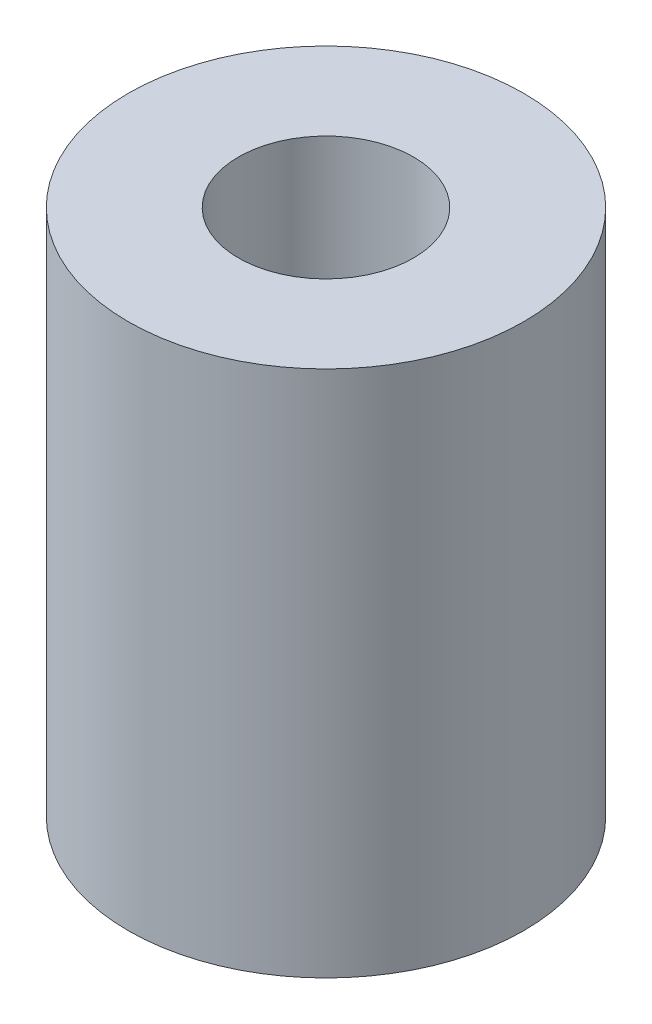
ISO-10303-21;
HEADER;
FILE_DESCRIPTION(('STEP AP214'),'2;1');
FILE_NAME('part.step','',(''),(''),'','','');
FILE_SCHEMA(('AUTOMOTIVE_DESIGN { 1 0 10303 214 1 1 1 1 }'));
ENDSEC;
DATA;
#1=APPLICATION_CONTEXT('core data for automotive mechanical design processes');
#2=APPLICATION_PROTOCOL_DEFINITION('international standard','automotive_design',2000,#1);
#3=PRODUCT_CONTEXT('',#1,'mechanical');
#4=PRODUCT('Part','Part','',(#3));
#5=PRODUCT_RELATED_PRODUCT_CATEGORY('part','',(#4));
#6=PRODUCT_DEFINITION_FORMATION('','',#4);
#7=PRODUCT_DEFINITION_CONTEXT('part definition',#1,'design');
#8=PRODUCT_DEFINITION('design','',#6,#7);
#9=PRODUCT_DEFINITION_SHAPE('','',#8);
#10=(LENGTH_UNIT() NAMED_UNIT(*) SI_UNIT(.MILLI.,.METRE.));
#11=(NAMED_UNIT(*) PLANE_ANGLE_UNIT() SI_UNIT($,.RADIAN.));
#12=(NAMED_UNIT(*) SI_UNIT($,.STERADIAN.) SOLID_ANGLE_UNIT());
#13=UNCERTAINTY_MEASURE_WITH_UNIT(LENGTH_MEASURE(1.E-05),#10,'distance_accuracy_value','');
#14=(GEOMETRIC_REPRESENTATION_CONTEXT(3) GLOBAL_UNCERTAINTY_ASSIGNED_CONTEXT((#13)) GLOBAL_UNIT_ASSIGNED_CONTEXT((#10,
#11,#12)) REPRESENTATION_CONTEXT('',''));
#15=CARTESIAN_POINT('',(0.,0.,0.));
#16=DIRECTION('',(0.,0.,1.));
#17=DIRECTION('',(1.,0.,0.));
#18=AXIS2_PLACEMENT_3D('',#15,#16,#17);
#19=CARTESIAN_POINT('',(0.,6.35,0.));
#20=DIRECTION('',(0.,-1.,0.));
#21=DIRECTION('',(0.,0.,-1.));
#22=AXIS2_PLACEMENT_3D('',#19,#20,#21);
#23=CYLINDRICAL_SURFACE('',#22,2.1082);
#24=CARTESIAN_POINT('',(0.,-6.35,0.));
#25=DIRECTION('',(0.,-1.,0.));
#26=DIRECTION('',(0.,0.,-1.));
#27=AXIS2_PLACEMENT_3D('',#24,#25,#26);
#28=CIRCLE('',#27,2.1082);
#29=CARTESIAN_POINT('',(0.,-6.35,-2.1082));
#30=VERTEX_POINT('',#29);
#31=EDGE_CURVE('E25',#30,#30,#28,.T.);
#32=ORIENTED_EDGE('',*,*,#31,.T.);
#33=EDGE_LOOP('',(#32));
#34=FACE_BOUND('',#33,.T.);
#35=CARTESIAN_POINT('',(0.,6.35,0.));
#36=DIRECTION('',(0.,-1.,0.));
#37=DIRECTION('',(0.,0.,-1.));
#38=AXIS2_PLACEMENT_3D('',#35,#36,#37);
#39=CIRCLE('',#38,2.1082);
#40=CARTESIAN_POINT('',(0.,6.35,-2.1082));
#41=VERTEX_POINT('',#40);
#42=EDGE_CURVE('E16',#41,#41,#39,.T.);
#43=ORIENTED_EDGE('',*,*,#42,.F.);
#44=EDGE_LOOP('',(#43));
#45=FACE_BOUND('',#44,.T.);
#46=ADVANCED_FACE('F13',(#34,#45),#23,.F.);
#47=CARTESIAN_POINT('',(0.,6.35,0.));
#48=DIRECTION('',(0.,1.,0.));
#49=DIRECTION('',(0.,0.,1.));
#50=AXIS2_PLACEMENT_3D('',#47,#48,#49);
#51=PLANE('',#50);
#52=ORIENTED_EDGE('',*,*,#42,.T.);
#53=EDGE_LOOP('',(#52));
#54=FACE_BOUND('',#53,.T.);
#55=CARTESIAN_POINT('',(0.,6.35,0.));
#56=DIRECTION('',(0.,-1.,0.));
#57=DIRECTION('',(0.,0.,-1.));
#58=AXIS2_PLACEMENT_3D('',#55,#56,#57);
#59=CIRCLE('',#58,4.7625);
#60=CARTESIAN_POINT('',(0.,6.35,-4.7625));
#61=VERTEX_POINT('',#60);
#62=EDGE_CURVE('E20',#61,#61,#59,.T.);
#63=ORIENTED_EDGE('',*,*,#62,.F.);
#64=EDGE_LOOP('',(#63));
#65=FACE_BOUND('',#64,.T.);
#66=ADVANCED_FACE('F33',(#54,#65),#51,.T.);
#67=CARTESIAN_POINT('',(0.,-6.35,0.));
#68=DIRECTION('',(0.,1.,0.));
#69=DIRECTION('',(0.,0.,1.));
#70=AXIS2_PLACEMENT_3D('',#67,#68,#69);
#71=PLANE('',#70);
#72=ORIENTED_EDGE('',*,*,#31,.F.);
#73=EDGE_LOOP('',(#72));
#74=FACE_BOUND('',#73,.T.);
#75=CARTESIAN_POINT('',(0.,-6.35,0.));
#76=DIRECTION('',(0.,-1.,0.));
#77=DIRECTION('',(0.,0.,-1.));
#78=AXIS2_PLACEMENT_3D('',#75,#76,#77);
#79=CIRCLE('',#78,4.7625);
#80=CARTESIAN_POINT('',(0.,-6.35,-4.7625));
#81=VERTEX_POINT('',#80);
#82=EDGE_CURVE('E9',#81,#81,#79,.F.);
#83=ORIENTED_EDGE('',*,*,#82,.F.);
#84=EDGE_LOOP('',(#83));
#85=FACE_BOUND('',#84,.T.);
#86=ADVANCED_FACE('F41',(#74,#85),#71,.F.);
#87=CARTESIAN_POINT('',(0.,6.35,0.));
#88=DIRECTION('',(0.,-1.,0.));
#89=DIRECTION('',(0.,0.,-1.));
#90=AXIS2_PLACEMENT_3D('',#87,#88,#89);
#91=CYLINDRICAL_SURFACE('',#90,4.7625);
#92=ORIENTED_EDGE('',*,*,#82,.T.);
#93=EDGE_LOOP('',(#92));
#94=FACE_BOUND('',#93,.T.);
#95=ORIENTED_EDGE('',*,*,#62,.T.);
#96=EDGE_LOOP('',(#95));
#97=FACE_BOUND('',#96,.T.);
#98=ADVANCED_FACE('F42',(#94,#97),#91,.T.);
#99=CLOSED_SHELL('',(#46,#66,#86,#98));
#100=MANIFOLD_SOLID_BREP('B1',#99);
#101=ADVANCED_BREP_SHAPE_REPRESENTATION('',(#18,#100),#14);
#102=SHAPE_DEFINITION_REPRESENTATION(#9,#101);
ENDSEC;
END-ISO-10303-21;
